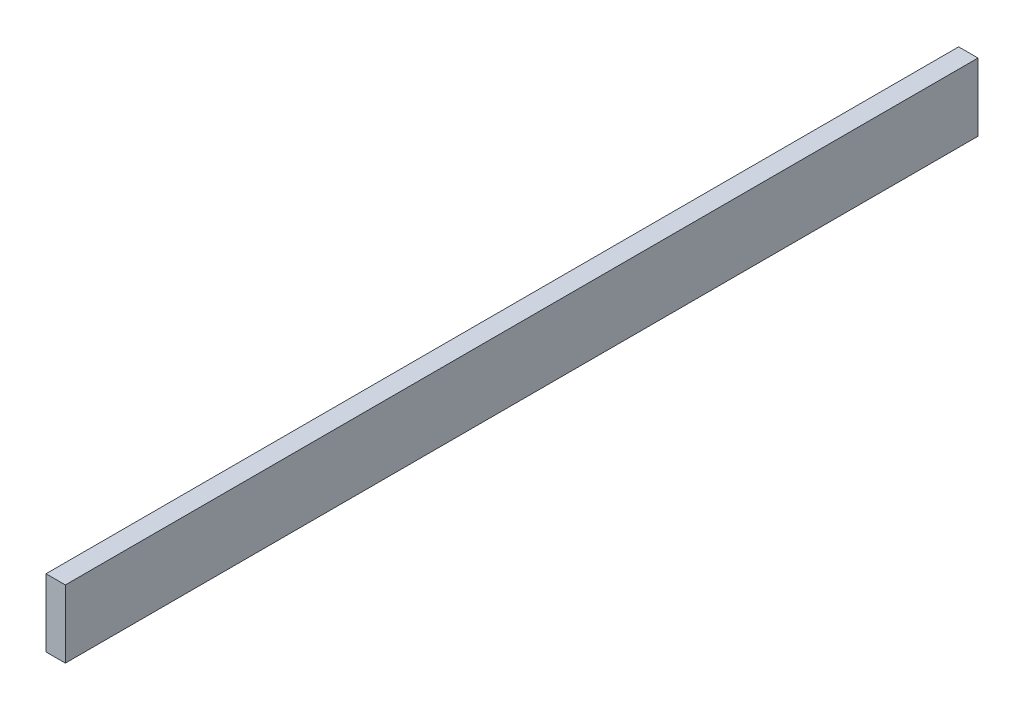
ISO-10303-21;
HEADER;
FILE_DESCRIPTION(('STEP AP214'),'2;1');
FILE_NAME('part.step','',(''),(''),'','','');
FILE_SCHEMA(('AUTOMOTIVE_DESIGN { 1 0 10303 214 1 1 1 1 }'));
ENDSEC;
DATA;
#1=APPLICATION_CONTEXT('core data for automotive mechanical design processes');
#2=APPLICATION_PROTOCOL_DEFINITION('international standard','automotive_design',2000,#1);
#3=PRODUCT_CONTEXT('',#1,'mechanical');
#4=PRODUCT('Part','Part','',(#3));
#5=PRODUCT_RELATED_PRODUCT_CATEGORY('part','',(#4));
#6=PRODUCT_DEFINITION_FORMATION('','',#4);
#7=PRODUCT_DEFINITION_CONTEXT('part definition',#1,'design');
#8=PRODUCT_DEFINITION('design','',#6,#7);
#9=PRODUCT_DEFINITION_SHAPE('','',#8);
#10=(LENGTH_UNIT() NAMED_UNIT(*) SI_UNIT(.MILLI.,.METRE.));
#11=(NAMED_UNIT(*) PLANE_ANGLE_UNIT() SI_UNIT($,.RADIAN.));
#12=(NAMED_UNIT(*) SI_UNIT($,.STERADIAN.) SOLID_ANGLE_UNIT());
#13=UNCERTAINTY_MEASURE_WITH_UNIT(LENGTH_MEASURE(1.E-05),#10,'distance_accuracy_value','');
#14=(GEOMETRIC_REPRESENTATION_CONTEXT(3) GLOBAL_UNCERTAINTY_ASSIGNED_CONTEXT((#13)) GLOBAL_UNIT_ASSIGNED_CONTEXT((#10,
#11,#12)) REPRESENTATION_CONTEXT('',''));
#15=CARTESIAN_POINT('',(0.,0.,0.));
#16=DIRECTION('',(0.,0.,1.));
#17=DIRECTION('',(1.,0.,0.));
#18=AXIS2_PLACEMENT_3D('',#15,#16,#17);
#19=CARTESIAN_POINT('',(1324.,1528.,-660.));
#20=DIRECTION('',(-1.,0.,0.));
#21=DIRECTION('',(0.,0.,1.));
#22=AXIS2_PLACEMENT_3D('',#19,#20,#21);
#23=PLANE('',#22);
#24=DIRECTION('',(0.,-1.,0.));
#25=VECTOR('',#24,1.);
#26=CARTESIAN_POINT('',(1324.,1528.,0.));
#27=LINE('',#26,#25);
#28=CARTESIAN_POINT('',(1324.,1577.,0.));
#29=VERTEX_POINT('',#28);
#30=CARTESIAN_POINT('',(1324.,1528.,0.));
#31=VERTEX_POINT('',#30);
#32=EDGE_CURVE('E103',#29,#31,#27,.T.);
#33=ORIENTED_EDGE('',*,*,#32,.F.);
#34=DIRECTION('',(0.,0.,1.));
#35=VECTOR('',#34,1.);
#36=CARTESIAN_POINT('',(1324.,1577.,-660.));
#37=LINE('',#36,#35);
#38=CARTESIAN_POINT('',(1324.,1577.,-660.));
#39=VERTEX_POINT('',#38);
#40=EDGE_CURVE('E11',#39,#29,#37,.T.);
#41=ORIENTED_EDGE('',*,*,#40,.F.);
#42=DIRECTION('',(0.,-1.,0.));
#43=VECTOR('',#42,1.);
#44=CARTESIAN_POINT('',(1324.,1528.,-660.));
#45=LINE('',#44,#43);
#46=CARTESIAN_POINT('',(1324.,1528.,-660.));
#47=VERTEX_POINT('',#46);
#48=EDGE_CURVE('E97',#39,#47,#45,.T.);
#49=ORIENTED_EDGE('',*,*,#48,.T.);
#50=DIRECTION('',(0.,0.,1.));
#51=VECTOR('',#50,1.);
#52=CARTESIAN_POINT('',(1324.,1528.,-660.));
#53=LINE('',#52,#51);
#54=EDGE_CURVE('E42',#47,#31,#53,.T.);
#55=ORIENTED_EDGE('',*,*,#54,.T.);
#56=EDGE_LOOP('',(#33,#41,#49,#55));
#57=FACE_BOUND('',#56,.T.);
#58=ADVANCED_FACE('F39',(#57),#23,.T.);
#59=CARTESIAN_POINT('',(1324.,1577.,-660.));
#60=DIRECTION('',(0.,1.,0.));
#61=DIRECTION('',(0.,0.,1.));
#62=AXIS2_PLACEMENT_3D('',#59,#60,#61);
#63=PLANE('',#62);
#64=DIRECTION('',(-1.,0.,0.));
#65=VECTOR('',#64,1.);
#66=CARTESIAN_POINT('',(1324.,1577.,0.));
#67=LINE('',#66,#65);
#68=CARTESIAN_POINT('',(1338.,1577.,0.));
#69=VERTEX_POINT('',#68);
#70=EDGE_CURVE('E99',#69,#29,#67,.T.);
#71=ORIENTED_EDGE('',*,*,#70,.F.);
#72=DIRECTION('',(0.,0.,1.));
#73=VECTOR('',#72,1.);
#74=CARTESIAN_POINT('',(1338.,1577.,-660.));
#75=LINE('',#74,#73);
#76=CARTESIAN_POINT('',(1338.,1577.,-660.));
#77=VERTEX_POINT('',#76);
#78=EDGE_CURVE('E48',#77,#69,#75,.T.);
#79=ORIENTED_EDGE('',*,*,#78,.F.);
#80=DIRECTION('',(-1.,0.,0.));
#81=VECTOR('',#80,1.);
#82=CARTESIAN_POINT('',(1324.,1577.,-660.));
#83=LINE('',#82,#81);
#84=EDGE_CURVE('E94',#77,#39,#83,.T.);
#85=ORIENTED_EDGE('',*,*,#84,.T.);
#86=ORIENTED_EDGE('',*,*,#40,.T.);
#87=EDGE_LOOP('',(#71,#79,#85,#86));
#88=FACE_BOUND('',#87,.T.);
#89=ADVANCED_FACE('F113',(#88),#63,.T.);
#90=CARTESIAN_POINT('',(1338.,1528.,-660.));
#91=DIRECTION('',(1.,0.,0.));
#92=DIRECTION('',(0.,0.,-1.));
#93=AXIS2_PLACEMENT_3D('',#90,#91,#92);
#94=PLANE('',#93);
#95=DIRECTION('',(0.,1.,0.));
#96=VECTOR('',#95,1.);
#97=CARTESIAN_POINT('',(1338.,1528.,0.));
#98=LINE('',#97,#96);
#99=CARTESIAN_POINT('',(1338.,1528.,0.));
#100=VERTEX_POINT('',#99);
#101=EDGE_CURVE('E89',#100,#69,#98,.T.);
#102=ORIENTED_EDGE('',*,*,#101,.F.);
#103=DIRECTION('',(0.,0.,1.));
#104=VECTOR('',#103,1.);
#105=CARTESIAN_POINT('',(1338.,1528.,-660.));
#106=LINE('',#105,#104);
#107=CARTESIAN_POINT('',(1338.,1528.,-660.));
#108=VERTEX_POINT('',#107);
#109=EDGE_CURVE('E84',#108,#100,#106,.T.);
#110=ORIENTED_EDGE('',*,*,#109,.F.);
#111=DIRECTION('',(0.,1.,0.));
#112=VECTOR('',#111,1.);
#113=CARTESIAN_POINT('',(1338.,1528.,-660.));
#114=LINE('',#113,#112);
#115=EDGE_CURVE('E87',#108,#77,#114,.T.);
#116=ORIENTED_EDGE('',*,*,#115,.T.);
#117=ORIENTED_EDGE('',*,*,#78,.T.);
#118=EDGE_LOOP('',(#102,#110,#116,#117));
#119=FACE_BOUND('',#118,.T.);
#120=ADVANCED_FACE('F86',(#119),#94,.T.);
#121=CARTESIAN_POINT('',(1324.,1528.,-660.));
#122=DIRECTION('',(0.,-1.,0.));
#123=DIRECTION('',(0.,0.,-1.));
#124=AXIS2_PLACEMENT_3D('',#121,#122,#123);
#125=PLANE('',#124);
#126=DIRECTION('',(1.,0.,0.));
#127=VECTOR('',#126,1.);
#128=CARTESIAN_POINT('',(1324.,1528.,0.));
#129=LINE('',#128,#127);
#130=EDGE_CURVE('E106',#31,#100,#129,.T.);
#131=ORIENTED_EDGE('',*,*,#130,.F.);
#132=ORIENTED_EDGE('',*,*,#54,.F.);
#133=DIRECTION('',(1.,0.,0.));
#134=VECTOR('',#133,1.);
#135=CARTESIAN_POINT('',(1324.,1528.,-660.));
#136=LINE('',#135,#134);
#137=EDGE_CURVE('E93',#47,#108,#136,.T.);
#138=ORIENTED_EDGE('',*,*,#137,.T.);
#139=ORIENTED_EDGE('',*,*,#109,.T.);
#140=EDGE_LOOP('',(#131,#132,#138,#139));
#141=FACE_BOUND('',#140,.T.);
#142=ADVANCED_FACE('F96',(#141),#125,.T.);
#143=CARTESIAN_POINT('',(0.,0.,-660.));
#144=DIRECTION('',(0.,0.,-1.));
#145=DIRECTION('',(-1.,0.,0.));
#146=AXIS2_PLACEMENT_3D('',#143,#144,#145);
#147=PLANE('',#146);
#148=ORIENTED_EDGE('',*,*,#48,.F.);
#149=ORIENTED_EDGE('',*,*,#84,.F.);
#150=ORIENTED_EDGE('',*,*,#115,.F.);
#151=ORIENTED_EDGE('',*,*,#137,.F.);
#152=EDGE_LOOP('',(#148,#149,#150,#151));
#153=FACE_BOUND('',#152,.T.);
#154=ADVANCED_FACE('F92',(#153),#147,.T.);
#155=CARTESIAN_POINT('',(0.,0.,0.));
#156=DIRECTION('',(0.,0.,-1.));
#157=DIRECTION('',(-1.,0.,0.));
#158=AXIS2_PLACEMENT_3D('',#155,#156,#157);
#159=PLANE('',#158);
#160=ORIENTED_EDGE('',*,*,#32,.T.);
#161=ORIENTED_EDGE('',*,*,#130,.T.);
#162=ORIENTED_EDGE('',*,*,#101,.T.);
#163=ORIENTED_EDGE('',*,*,#70,.T.);
#164=EDGE_LOOP('',(#160,#161,#162,#163));
#165=FACE_BOUND('',#164,.T.);
#166=ADVANCED_FACE('F112',(#165),#159,.F.);
#167=CLOSED_SHELL('',(#58,#89,#120,#142,#154,#166));
#168=MANIFOLD_SOLID_BREP('B2',#167);
#169=ADVANCED_BREP_SHAPE_REPRESENTATION('',(#18,#168),#14);
#170=SHAPE_DEFINITION_REPRESENTATION(#9,#169);
ENDSEC;
END-ISO-10303-21;
